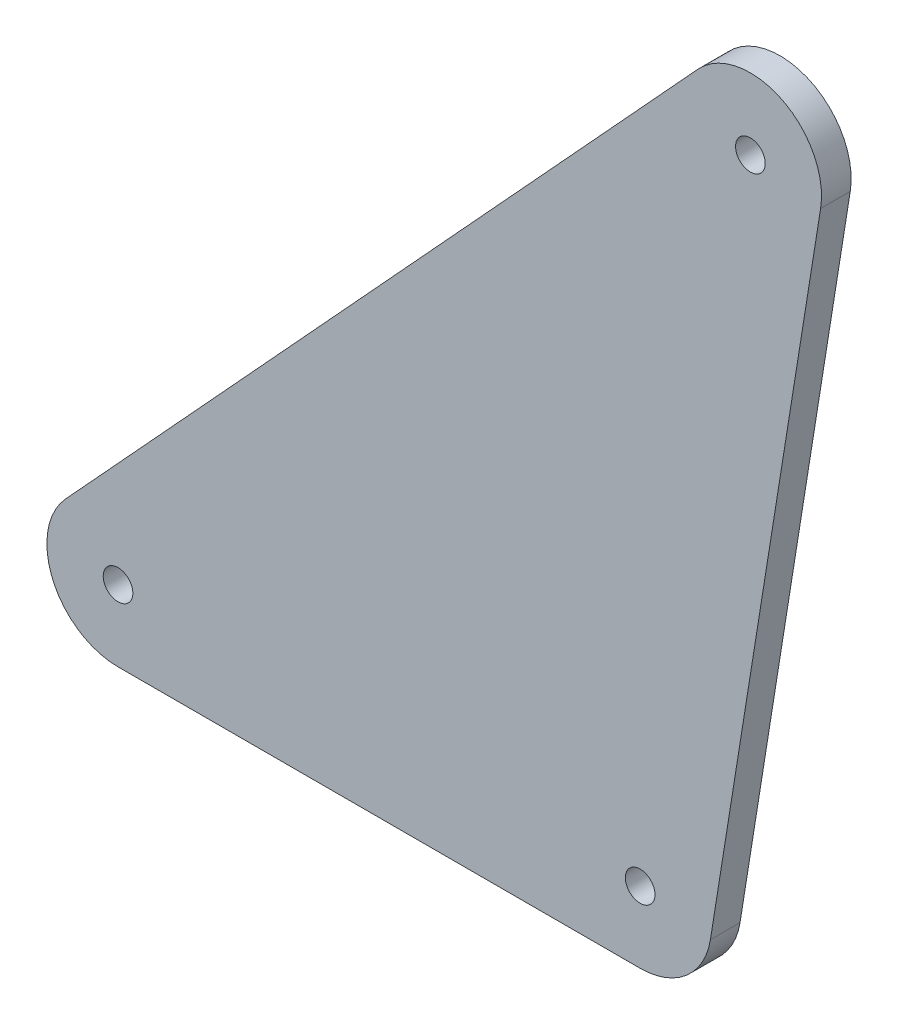
ISO-10303-21;
HEADER;
FILE_DESCRIPTION(('STEP AP214'),'2;1');
FILE_NAME('part.step','',(''),(''),'','','');
FILE_SCHEMA(('AUTOMOTIVE_DESIGN { 1 0 10303 214 1 1 1 1 }'));
ENDSEC;
DATA;
#1=APPLICATION_CONTEXT('core data for automotive mechanical design processes');
#2=APPLICATION_PROTOCOL_DEFINITION('international standard','automotive_design',2000,#1);
#3=PRODUCT_CONTEXT('',#1,'mechanical');
#4=PRODUCT('Part','Part','',(#3));
#5=PRODUCT_RELATED_PRODUCT_CATEGORY('part','',(#4));
#6=PRODUCT_DEFINITION_FORMATION('','',#4);
#7=PRODUCT_DEFINITION_CONTEXT('part definition',#1,'design');
#8=PRODUCT_DEFINITION('design','',#6,#7);
#9=PRODUCT_DEFINITION_SHAPE('','',#8);
#10=(LENGTH_UNIT() NAMED_UNIT(*) SI_UNIT(.MILLI.,.METRE.));
#11=(NAMED_UNIT(*) PLANE_ANGLE_UNIT() SI_UNIT($,.RADIAN.));
#12=(NAMED_UNIT(*) SI_UNIT($,.STERADIAN.) SOLID_ANGLE_UNIT());
#13=UNCERTAINTY_MEASURE_WITH_UNIT(LENGTH_MEASURE(1.E-05),#10,'distance_accuracy_value','');
#14=(GEOMETRIC_REPRESENTATION_CONTEXT(3) GLOBAL_UNCERTAINTY_ASSIGNED_CONTEXT((#13)) GLOBAL_UNIT_ASSIGNED_CONTEXT((#10,
#11,#12)) REPRESENTATION_CONTEXT('',''));
#15=CARTESIAN_POINT('',(0.,0.,0.));
#16=DIRECTION('',(0.,0.,1.));
#17=DIRECTION('',(1.,0.,0.));
#18=AXIS2_PLACEMENT_3D('',#15,#16,#17);
#19=CARTESIAN_POINT('',(0.,3.28901489389214E-10,0.));
#20=DIRECTION('',(0.,0.,1.));
#21=DIRECTION('',(1.,0.,0.));
#22=AXIS2_PLACEMENT_3D('',#19,#20,#21);
#23=CYLINDRICAL_SURFACE('',#22,12.0000000007734);
#24=CARTESIAN_POINT('',(0.,3.28901489389214E-10,5.));
#25=DIRECTION('',(0.,0.,1.));
#26=DIRECTION('',(1.,0.,0.));
#27=AXIS2_PLACEMENT_3D('',#24,#25,#26);
#28=CIRCLE('',#27,12.0000000007734);
#29=CARTESIAN_POINT('',(-8.83722030743892,8.11809936263968,5.));
#30=VERTEX_POINT('',#29);
#31=CARTESIAN_POINT('',(0.,-12.0000000004445,5.));
#32=VERTEX_POINT('',#31);
#33=EDGE_CURVE('E119',#30,#32,#28,.T.);
#34=ORIENTED_EDGE('',*,*,#33,.F.);
#35=DIRECTION('',(0.,0.,1.));
#36=VECTOR('',#35,1.);
#37=CARTESIAN_POINT('',(-8.83722030743892,8.11809936263968,0.));
#38=LINE('',#37,#36);
#39=CARTESIAN_POINT('',(-8.83722030743892,8.11809936263968,0.));
#40=VERTEX_POINT('',#39);
#41=EDGE_CURVE('E11',#40,#30,#38,.T.);
#42=ORIENTED_EDGE('',*,*,#41,.F.);
#43=CARTESIAN_POINT('',(0.,3.28901489389214E-10,0.));
#44=DIRECTION('',(0.,0.,1.));
#45=DIRECTION('',(1.,0.,0.));
#46=AXIS2_PLACEMENT_3D('',#43,#44,#45);
#47=CIRCLE('',#46,12.0000000007734);
#48=CARTESIAN_POINT('',(0.,-12.0000000004445,0.));
#49=VERTEX_POINT('',#48);
#50=EDGE_CURVE('E134',#40,#49,#47,.T.);
#51=ORIENTED_EDGE('',*,*,#50,.T.);
#52=DIRECTION('',(0.,0.,1.));
#53=VECTOR('',#52,1.);
#54=CARTESIAN_POINT('',(0.,-12.0000000004445,0.));
#55=LINE('',#54,#53);
#56=EDGE_CURVE('E37',#49,#32,#55,.T.);
#57=ORIENTED_EDGE('',*,*,#56,.T.);
#58=EDGE_LOOP('',(#34,#42,#51,#57));
#59=FACE_BOUND('',#58,.T.);
#60=ADVANCED_FACE('F34',(#59),#23,.T.);
#61=CARTESIAN_POINT('',(97.8346053093245,124.239174198033,0.));
#62=DIRECTION('',(-0.736435025572447,0.676508280148964,0.));
#63=DIRECTION('',(-0.676508280148964,-0.736435025572447,0.));
#64=AXIS2_PLACEMENT_3D('',#61,#62,#63);
#65=PLANE('',#64);
#66=DIRECTION('',(-0.676508280148964,-0.736435025572447,0.));
#67=VECTOR('',#66,1.);
#68=CARTESIAN_POINT('',(97.8346053093245,124.239174198033,5.));
#69=LINE('',#68,#67);
#70=CARTESIAN_POINT('',(97.8346053093245,124.239174198033,5.));
#71=VERTEX_POINT('',#70);
#72=EDGE_CURVE('E132',#71,#30,#69,.T.);
#73=ORIENTED_EDGE('',*,*,#72,.F.);
#74=DIRECTION('',(0.,0.,1.));
#75=VECTOR('',#74,1.);
#76=CARTESIAN_POINT('',(97.8346053093245,124.239174198033,0.));
#77=LINE('',#76,#75);
#78=CARTESIAN_POINT('',(97.8346053093245,124.239174198033,0.));
#79=VERTEX_POINT('',#78);
#80=EDGE_CURVE('E43',#79,#71,#77,.T.);
#81=ORIENTED_EDGE('',*,*,#80,.F.);
#82=DIRECTION('',(-0.676508280148964,-0.736435025572447,0.));
#83=VECTOR('',#82,1.);
#84=CARTESIAN_POINT('',(97.8346053093245,124.239174198033,0.));
#85=LINE('',#84,#83);
#86=EDGE_CURVE('E109',#79,#40,#85,.T.);
#87=ORIENTED_EDGE('',*,*,#86,.T.);
#88=ORIENTED_EDGE('',*,*,#41,.T.);
#89=EDGE_LOOP('',(#73,#81,#87,#88));
#90=FACE_BOUND('',#89,.T.);
#91=ADVANCED_FACE('F142',(#90),#65,.T.);
#92=CARTESIAN_POINT('',(106.671825616526,116.12107483594,0.));
#93=DIRECTION('',(0.,0.,1.));
#94=DIRECTION('',(1.,0.,0.));
#95=AXIS2_PLACEMENT_3D('',#92,#93,#94);
#96=CYLINDRICAL_SURFACE('',#95,12.0000000004513);
#97=CARTESIAN_POINT('',(106.671825616526,116.12107483594,5.));
#98=DIRECTION('',(0.,0.,1.));
#99=DIRECTION('',(1.,0.,0.));
#100=AXIS2_PLACEMENT_3D('',#97,#98,#99);
#101=CIRCLE('',#100,12.0000000004513);
#102=CARTESIAN_POINT('',(118.520914885653,114.223949773356,5.));
#103=VERTEX_POINT('',#102);
#104=EDGE_CURVE('E96',#103,#71,#101,.T.);
#105=ORIENTED_EDGE('',*,*,#104,.F.);
#106=DIRECTION('',(0.,0.,1.));
#107=VECTOR('',#106,1.);
#108=CARTESIAN_POINT('',(118.520914885653,114.223949773356,0.));
#109=LINE('',#108,#107);
#110=CARTESIAN_POINT('',(118.520914885653,114.223949773356,0.));
#111=VERTEX_POINT('',#110);
#112=EDGE_CURVE('E91',#111,#103,#109,.T.);
#113=ORIENTED_EDGE('',*,*,#112,.F.);
#114=CARTESIAN_POINT('',(106.671825616526,116.12107483594,0.));
#115=DIRECTION('',(0.,0.,1.));
#116=DIRECTION('',(1.,0.,0.));
#117=AXIS2_PLACEMENT_3D('',#114,#115,#116);
#118=CIRCLE('',#117,12.0000000004513);
#119=EDGE_CURVE('E94',#111,#79,#118,.T.);
#120=ORIENTED_EDGE('',*,*,#119,.T.);
#121=ORIENTED_EDGE('',*,*,#80,.T.);
#122=EDGE_LOOP('',(#105,#113,#120,#121));
#123=FACE_BOUND('',#122,.T.);
#124=ADVANCED_FACE('F93',(#123),#96,.T.);
#125=CARTESIAN_POINT('',(99.9290892726026,-1.89712506239571,0.));
#126=DIRECTION('',(0.987424105723471,-0.15809375520938,0.));
#127=DIRECTION('',(0.15809375520938,0.987424105723471,0.));
#128=AXIS2_PLACEMENT_3D('',#125,#126,#127);
#129=PLANE('',#128);
#130=DIRECTION('',(0.15809375520938,0.987424105723471,0.));
#131=VECTOR('',#130,1.);
#132=CARTESIAN_POINT('',(99.9290892726026,-1.89712506239571,5.));
#133=LINE('',#132,#131);
#134=CARTESIAN_POINT('',(99.9290892726026,-1.89712506239571,5.));
#135=VERTEX_POINT('',#134);
#136=EDGE_CURVE('E129',#135,#103,#133,.T.);
#137=ORIENTED_EDGE('',*,*,#136,.F.);
#138=DIRECTION('',(0.,0.,1.));
#139=VECTOR('',#138,1.);
#140=CARTESIAN_POINT('',(99.9290892726026,-1.89712506239571,0.));
#141=LINE('',#140,#139);
#142=CARTESIAN_POINT('',(99.9290892726026,-1.89712506239571,0.));
#143=VERTEX_POINT('',#142);
#144=EDGE_CURVE('E101',#143,#135,#141,.T.);
#145=ORIENTED_EDGE('',*,*,#144,.F.);
#146=DIRECTION('',(0.15809375520938,0.987424105723471,0.));
#147=VECTOR('',#146,1.);
#148=CARTESIAN_POINT('',(99.9290892726026,-1.89712506239571,0.));
#149=LINE('',#148,#147);
#150=EDGE_CURVE('E107',#143,#111,#149,.T.);
#151=ORIENTED_EDGE('',*,*,#150,.T.);
#152=ORIENTED_EDGE('',*,*,#112,.T.);
#153=EDGE_LOOP('',(#137,#145,#151,#152));
#154=FACE_BOUND('',#153,.T.);
#155=ADVANCED_FACE('F111',(#154),#129,.T.);
#156=CARTESIAN_POINT('',(88.0800000032626,2.22253465639771E-10,0.));
#157=DIRECTION('',(0.,0.,1.));
#158=DIRECTION('',(1.,0.,0.));
#159=AXIS2_PLACEMENT_3D('',#156,#157,#158);
#160=CYLINDRICAL_SURFACE('',#159,12.0000000006668);
#161=CARTESIAN_POINT('',(88.0800000032626,2.22253465639771E-10,5.));
#162=DIRECTION('',(0.,0.,1.));
#163=DIRECTION('',(1.,0.,0.));
#164=AXIS2_PLACEMENT_3D('',#161,#162,#163);
#165=CIRCLE('',#164,12.0000000006668);
#166=CARTESIAN_POINT('',(88.0800000032626,-12.0000000004445,5.));
#167=VERTEX_POINT('',#166);
#168=EDGE_CURVE('E126',#167,#135,#165,.T.);
#169=ORIENTED_EDGE('',*,*,#168,.F.);
#170=DIRECTION('',(0.,0.,1.));
#171=VECTOR('',#170,1.);
#172=CARTESIAN_POINT('',(88.0800000032626,-12.0000000004445,0.));
#173=LINE('',#172,#171);
#174=CARTESIAN_POINT('',(88.0800000032626,-12.0000000004445,0.));
#175=VERTEX_POINT('',#174);
#176=EDGE_CURVE('E137',#175,#167,#173,.T.);
#177=ORIENTED_EDGE('',*,*,#176,.F.);
#178=CARTESIAN_POINT('',(88.0800000032626,2.22253465639771E-10,0.));
#179=DIRECTION('',(0.,0.,1.));
#180=DIRECTION('',(1.,0.,0.));
#181=AXIS2_PLACEMENT_3D('',#178,#179,#180);
#182=CIRCLE('',#181,12.0000000006668);
#183=EDGE_CURVE('E112',#175,#143,#182,.T.);
#184=ORIENTED_EDGE('',*,*,#183,.T.);
#185=ORIENTED_EDGE('',*,*,#144,.T.);
#186=EDGE_LOOP('',(#169,#177,#184,#185));
#187=FACE_BOUND('',#186,.T.);
#188=ADVANCED_FACE('F155',(#187),#160,.T.);
#189=CARTESIAN_POINT('',(0.,-12.0000000004445,0.));
#190=DIRECTION('',(0.,-1.,0.));
#191=DIRECTION('',(0.,0.,-1.));
#192=AXIS2_PLACEMENT_3D('',#189,#190,#191);
#193=PLANE('',#192);
#194=DIRECTION('',(1.,0.,0.));
#195=VECTOR('',#194,1.);
#196=CARTESIAN_POINT('',(0.,-12.0000000004445,5.));
#197=LINE('',#196,#195);
#198=EDGE_CURVE('E122',#32,#167,#197,.T.);
#199=ORIENTED_EDGE('',*,*,#198,.F.);
#200=ORIENTED_EDGE('',*,*,#56,.F.);
#201=DIRECTION('',(1.,0.,0.));
#202=VECTOR('',#201,1.);
#203=CARTESIAN_POINT('',(0.,-12.0000000004445,0.));
#204=LINE('',#203,#202);
#205=EDGE_CURVE('E114',#49,#175,#204,.T.);
#206=ORIENTED_EDGE('',*,*,#205,.T.);
#207=ORIENTED_EDGE('',*,*,#176,.T.);
#208=EDGE_LOOP('',(#199,#200,#206,#207));
#209=FACE_BOUND('',#208,.T.);
#210=ADVANCED_FACE('F139',(#209),#193,.T.);
#211=CARTESIAN_POINT('',(0.,3.28901489389214E-10,0.));
#212=DIRECTION('',(0.,0.,1.));
#213=DIRECTION('',(1.,0.,0.));
#214=AXIS2_PLACEMENT_3D('',#211,#212,#213);
#215=PLANE('',#214);
#216=CARTESIAN_POINT('',(0.,3.28901489389214E-10,0.));
#217=DIRECTION('',(0.,0.,1.));
#218=DIRECTION('',(-1.,0.,0.));
#219=AXIS2_PLACEMENT_3D('',#216,#217,#218);
#220=CIRCLE('',#219,2.5);
#221=CARTESIAN_POINT('',(-2.5,3.28901489389214E-10,0.));
#222=VERTEX_POINT('',#221);
#223=EDGE_CURVE('E185',#222,#222,#220,.T.);
#224=ORIENTED_EDGE('',*,*,#223,.T.);
#225=EDGE_LOOP('',(#224));
#226=FACE_BOUND('',#225,.T.);
#227=CARTESIAN_POINT('',(106.671825616526,116.12107483594,0.));
#228=DIRECTION('',(0.,0.,1.));
#229=DIRECTION('',(-1.,0.,0.));
#230=AXIS2_PLACEMENT_3D('',#227,#228,#229);
#231=CIRCLE('',#230,2.50000000000001);
#232=CARTESIAN_POINT('',(104.171825616526,116.12107483594,0.));
#233=VERTEX_POINT('',#232);
#234=EDGE_CURVE('E193',#233,#233,#231,.T.);
#235=ORIENTED_EDGE('',*,*,#234,.T.);
#236=EDGE_LOOP('',(#235));
#237=FACE_BOUND('',#236,.T.);
#238=CARTESIAN_POINT('',(88.0800000032626,2.22253465639771E-10,0.));
#239=DIRECTION('',(0.,0.,1.));
#240=DIRECTION('',(-1.,0.,0.));
#241=AXIS2_PLACEMENT_3D('',#238,#239,#240);
#242=CIRCLE('',#241,2.5);
#243=CARTESIAN_POINT('',(85.5800000032626,2.22253465639771E-10,0.));
#244=VERTEX_POINT('',#243);
#245=EDGE_CURVE('E123',#244,#244,#242,.T.);
#246=ORIENTED_EDGE('',*,*,#245,.T.);
#247=EDGE_LOOP('',(#246));
#248=FACE_BOUND('',#247,.T.);
#249=ORIENTED_EDGE('',*,*,#50,.F.);
#250=ORIENTED_EDGE('',*,*,#86,.F.);
#251=ORIENTED_EDGE('',*,*,#119,.F.);
#252=ORIENTED_EDGE('',*,*,#150,.F.);
#253=ORIENTED_EDGE('',*,*,#183,.F.);
#254=ORIENTED_EDGE('',*,*,#205,.F.);
#255=EDGE_LOOP('',(#249,#250,#251,#252,#253,#254));
#256=FACE_BOUND('',#255,.T.);
#257=ADVANCED_FACE('F105',(#226,#237,#248,#256),#215,.F.);
#258=CARTESIAN_POINT('',(0.,3.28901489389214E-10,5.));
#259=DIRECTION('',(0.,0.,1.));
#260=DIRECTION('',(1.,0.,0.));
#261=AXIS2_PLACEMENT_3D('',#258,#259,#260);
#262=PLANE('',#261);
#263=CARTESIAN_POINT('',(0.,3.28901489389214E-10,5.));
#264=DIRECTION('',(0.,0.,1.));
#265=DIRECTION('',(-1.,0.,0.));
#266=AXIS2_PLACEMENT_3D('',#263,#264,#265);
#267=CIRCLE('',#266,2.5);
#268=CARTESIAN_POINT('',(-2.5,3.28901489389214E-10,5.));
#269=VERTEX_POINT('',#268);
#270=EDGE_CURVE('E188',#269,#269,#267,.T.);
#271=ORIENTED_EDGE('',*,*,#270,.F.);
#272=EDGE_LOOP('',(#271));
#273=FACE_BOUND('',#272,.T.);
#274=CARTESIAN_POINT('',(106.671825616526,116.12107483594,5.));
#275=DIRECTION('',(0.,0.,1.));
#276=DIRECTION('',(-1.,0.,0.));
#277=AXIS2_PLACEMENT_3D('',#274,#275,#276);
#278=CIRCLE('',#277,2.50000000000001);
#279=CARTESIAN_POINT('',(104.171825616526,116.12107483594,5.));
#280=VERTEX_POINT('',#279);
#281=EDGE_CURVE('E190',#280,#280,#278,.T.);
#282=ORIENTED_EDGE('',*,*,#281,.F.);
#283=EDGE_LOOP('',(#282));
#284=FACE_BOUND('',#283,.T.);
#285=CARTESIAN_POINT('',(88.0800000032626,2.22253465639771E-10,5.));
#286=DIRECTION('',(0.,0.,1.));
#287=DIRECTION('',(-1.,0.,0.));
#288=AXIS2_PLACEMENT_3D('',#285,#286,#287);
#289=CIRCLE('',#288,2.5);
#290=CARTESIAN_POINT('',(85.5800000032626,2.22253465639771E-10,5.));
#291=VERTEX_POINT('',#290);
#292=EDGE_CURVE('E196',#291,#291,#289,.T.);
#293=ORIENTED_EDGE('',*,*,#292,.F.);
#294=EDGE_LOOP('',(#293));
#295=FACE_BOUND('',#294,.T.);
#296=ORIENTED_EDGE('',*,*,#33,.T.);
#297=ORIENTED_EDGE('',*,*,#198,.T.);
#298=ORIENTED_EDGE('',*,*,#168,.T.);
#299=ORIENTED_EDGE('',*,*,#136,.T.);
#300=ORIENTED_EDGE('',*,*,#104,.T.);
#301=ORIENTED_EDGE('',*,*,#72,.T.);
#302=EDGE_LOOP('',(#296,#297,#298,#299,#300,#301));
#303=FACE_BOUND('',#302,.T.);
#304=ADVANCED_FACE('F141',(#273,#284,#295,#303),#262,.T.);
#305=CARTESIAN_POINT('',(88.0800000032626,2.22253465639771E-10,0.));
#306=DIRECTION('',(0.,0.,1.));
#307=DIRECTION('',(1.,0.,0.));
#308=AXIS2_PLACEMENT_3D('',#305,#306,#307);
#309=CYLINDRICAL_SURFACE('',#308,2.5);
#310=ORIENTED_EDGE('',*,*,#245,.F.);
#311=EDGE_LOOP('',(#310));
#312=FACE_BOUND('',#311,.T.);
#313=ORIENTED_EDGE('',*,*,#292,.T.);
#314=EDGE_LOOP('',(#313));
#315=FACE_BOUND('',#314,.T.);
#316=ADVANCED_FACE('F166',(#312,#315),#309,.F.);
#317=CARTESIAN_POINT('',(106.671825616526,116.12107483594,0.));
#318=DIRECTION('',(0.,0.,1.));
#319=DIRECTION('',(1.,0.,0.));
#320=AXIS2_PLACEMENT_3D('',#317,#318,#319);
#321=CYLINDRICAL_SURFACE('',#320,2.50000000000001);
#322=ORIENTED_EDGE('',*,*,#234,.F.);
#323=EDGE_LOOP('',(#322));
#324=FACE_BOUND('',#323,.T.);
#325=ORIENTED_EDGE('',*,*,#281,.T.);
#326=EDGE_LOOP('',(#325));
#327=FACE_BOUND('',#326,.T.);
#328=ADVANCED_FACE('F173',(#324,#327),#321,.F.);
#329=CARTESIAN_POINT('',(0.,3.28901489389214E-10,0.));
#330=DIRECTION('',(0.,0.,1.));
#331=DIRECTION('',(1.,0.,0.));
#332=AXIS2_PLACEMENT_3D('',#329,#330,#331);
#333=CYLINDRICAL_SURFACE('',#332,2.5);
#334=ORIENTED_EDGE('',*,*,#223,.F.);
#335=EDGE_LOOP('',(#334));
#336=FACE_BOUND('',#335,.T.);
#337=ORIENTED_EDGE('',*,*,#270,.T.);
#338=EDGE_LOOP('',(#337));
#339=FACE_BOUND('',#338,.T.);
#340=ADVANCED_FACE('F177',(#336,#339),#333,.F.);
#341=CLOSED_SHELL('',(#60,#91,#124,#155,#188,#210,#257,#304,#316,#328,#340));
#342=MANIFOLD_SOLID_BREP('B2',#341);
#343=ADVANCED_BREP_SHAPE_REPRESENTATION('',(#18,#342),#14);
#344=SHAPE_DEFINITION_REPRESENTATION(#9,#343);
ENDSEC;
END-ISO-10303-21;
